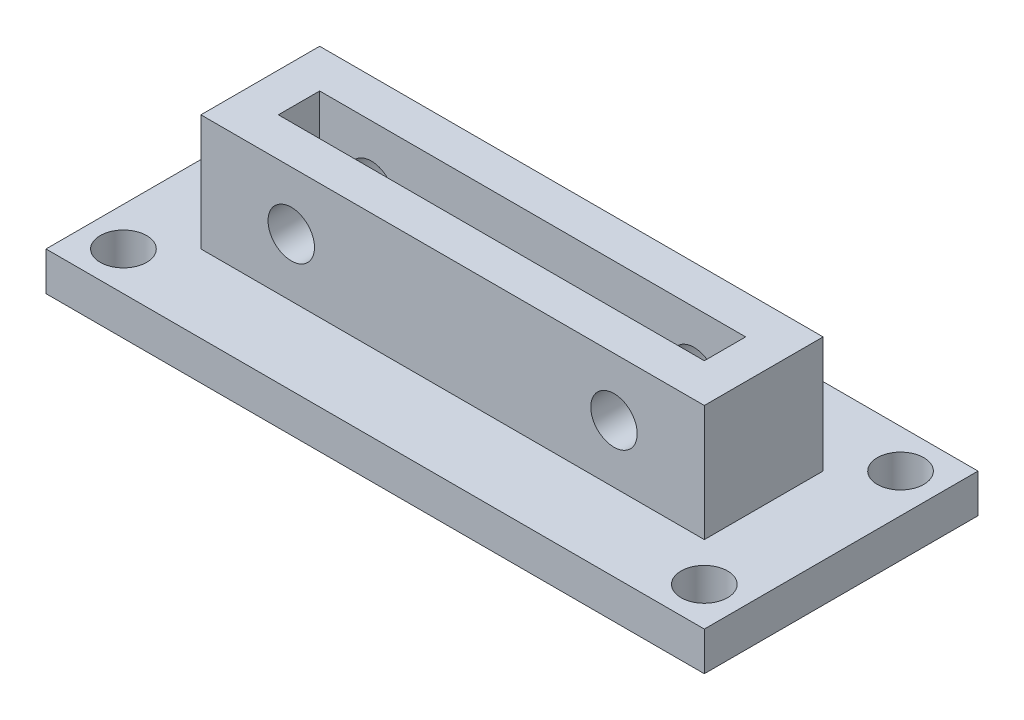
ISO-10303-21;
HEADER;
FILE_DESCRIPTION(('STEP AP214'),'2;1');
FILE_NAME('part.step','',(''),(''),'','','');
FILE_SCHEMA(('AUTOMOTIVE_DESIGN { 1 0 10303 214 1 1 1 1 }'));
ENDSEC;
DATA;
#1=APPLICATION_CONTEXT('core data for automotive mechanical design processes');
#2=APPLICATION_PROTOCOL_DEFINITION('international standard','automotive_design',2000,#1);
#3=PRODUCT_CONTEXT('',#1,'mechanical');
#4=PRODUCT('Part','Part','',(#3));
#5=PRODUCT_RELATED_PRODUCT_CATEGORY('part','',(#4));
#6=PRODUCT_DEFINITION_FORMATION('','',#4);
#7=PRODUCT_DEFINITION_CONTEXT('part definition',#1,'design');
#8=PRODUCT_DEFINITION('design','',#6,#7);
#9=PRODUCT_DEFINITION_SHAPE('','',#8);
#10=(LENGTH_UNIT() NAMED_UNIT(*) SI_UNIT(.MILLI.,.METRE.));
#11=(NAMED_UNIT(*) PLANE_ANGLE_UNIT() SI_UNIT($,.RADIAN.));
#12=(NAMED_UNIT(*) SI_UNIT($,.STERADIAN.) SOLID_ANGLE_UNIT());
#13=UNCERTAINTY_MEASURE_WITH_UNIT(LENGTH_MEASURE(1.E-05),#10,'distance_accuracy_value','');
#14=(GEOMETRIC_REPRESENTATION_CONTEXT(3) GLOBAL_UNCERTAINTY_ASSIGNED_CONTEXT((#13)) GLOBAL_UNIT_ASSIGNED_CONTEXT((#10,
#11,#12)) REPRESENTATION_CONTEXT('',''));
#15=CARTESIAN_POINT('',(0.,0.,0.));
#16=DIRECTION('',(0.,0.,1.));
#17=DIRECTION('',(1.,0.,0.));
#18=AXIS2_PLACEMENT_3D('',#15,#16,#17);
#19=CARTESIAN_POINT('',(0.,3.,0.));
#20=DIRECTION('',(0.,-1.,0.));
#21=DIRECTION('',(0.,0.,-1.));
#22=AXIS2_PLACEMENT_3D('',#19,#20,#21);
#23=PLANE('',#22);
#24=CARTESIAN_POINT('',(3.,3.,-18.2));
#25=DIRECTION('',(0.,1.,0.));
#26=DIRECTION('',(0.,0.,1.));
#27=AXIS2_PLACEMENT_3D('',#24,#25,#26);
#28=CIRCLE('',#27,1.79999999999999);
#29=CARTESIAN_POINT('',(3.,3.,-16.4));
#30=VERTEX_POINT('',#29);
#31=EDGE_CURVE('E246',#30,#30,#28,.T.);
#32=ORIENTED_EDGE('',*,*,#31,.F.);
#33=EDGE_LOOP('',(#32));
#34=FACE_BOUND('',#33,.T.);
#35=CARTESIAN_POINT('',(48.,3.,-18.2));
#36=DIRECTION('',(0.,1.,0.));
#37=DIRECTION('',(0.,0.,1.));
#38=AXIS2_PLACEMENT_3D('',#35,#36,#37);
#39=CIRCLE('',#38,1.79999999999999);
#40=CARTESIAN_POINT('',(48.,3.,-16.4));
#41=VERTEX_POINT('',#40);
#42=EDGE_CURVE('E252',#41,#41,#39,.T.);
#43=ORIENTED_EDGE('',*,*,#42,.F.);
#44=EDGE_LOOP('',(#43));
#45=FACE_BOUND('',#44,.T.);
#46=CARTESIAN_POINT('',(48.,3.,-3.));
#47=DIRECTION('',(0.,1.,0.));
#48=DIRECTION('',(0.,0.,1.));
#49=AXIS2_PLACEMENT_3D('',#46,#47,#48);
#50=CIRCLE('',#49,1.79999999999999);
#51=CARTESIAN_POINT('',(48.,3.,-1.20000000000001));
#52=VERTEX_POINT('',#51);
#53=EDGE_CURVE('E258',#52,#52,#50,.T.);
#54=ORIENTED_EDGE('',*,*,#53,.F.);
#55=EDGE_LOOP('',(#54));
#56=FACE_BOUND('',#55,.T.);
#57=CARTESIAN_POINT('',(3.,3.,-3.));
#58=DIRECTION('',(0.,1.,0.));
#59=DIRECTION('',(0.,0.,1.));
#60=AXIS2_PLACEMENT_3D('',#57,#58,#59);
#61=CIRCLE('',#60,1.79999999999999);
#62=CARTESIAN_POINT('',(3.,3.,-1.20000000000001));
#63=VERTEX_POINT('',#62);
#64=EDGE_CURVE('E264',#63,#63,#61,.T.);
#65=ORIENTED_EDGE('',*,*,#64,.F.);
#66=EDGE_LOOP('',(#65));
#67=FACE_BOUND('',#66,.T.);
#68=DIRECTION('',(0.,0.,1.));
#69=VECTOR('',#68,1.);
#70=CARTESIAN_POINT('',(0.,3.,0.));
#71=LINE('',#70,#69);
#72=CARTESIAN_POINT('',(0.,3.,-21.2));
#73=VERTEX_POINT('',#72);
#74=CARTESIAN_POINT('',(0.,3.,0.));
#75=VERTEX_POINT('',#74);
#76=EDGE_CURVE('E201',#73,#75,#71,.T.);
#77=ORIENTED_EDGE('',*,*,#76,.T.);
#78=DIRECTION('',(1.,0.,0.));
#79=VECTOR('',#78,1.);
#80=CARTESIAN_POINT('',(0.,3.,0.));
#81=LINE('',#80,#79);
#82=CARTESIAN_POINT('',(51.,3.,0.));
#83=VERTEX_POINT('',#82);
#84=EDGE_CURVE('E204',#75,#83,#81,.T.);
#85=ORIENTED_EDGE('',*,*,#84,.T.);
#86=DIRECTION('',(0.,0.,-1.));
#87=VECTOR('',#86,1.);
#88=CARTESIAN_POINT('',(51.,3.,0.));
#89=LINE('',#88,#87);
#90=CARTESIAN_POINT('',(51.,3.,-21.2));
#91=VERTEX_POINT('',#90);
#92=EDGE_CURVE('E207',#83,#91,#89,.T.);
#93=ORIENTED_EDGE('',*,*,#92,.T.);
#94=DIRECTION('',(-1.,0.,0.));
#95=VECTOR('',#94,1.);
#96=CARTESIAN_POINT('',(0.,3.,-21.2));
#97=LINE('',#96,#95);
#98=EDGE_CURVE('E209',#91,#73,#97,.T.);
#99=ORIENTED_EDGE('',*,*,#98,.T.);
#100=EDGE_LOOP('',(#77,#85,#93,#99));
#101=FACE_BOUND('',#100,.T.);
#102=DIRECTION('',(0.,0.,1.));
#103=VECTOR('',#102,1.);
#104=CARTESIAN_POINT('',(6.,3.,-15.2));
#105=LINE('',#104,#103);
#106=CARTESIAN_POINT('',(6.,3.,-15.2));
#107=VERTEX_POINT('',#106);
#108=CARTESIAN_POINT('',(6.,3.,-6.));
#109=VERTEX_POINT('',#108);
#110=EDGE_CURVE('E147',#107,#109,#105,.T.);
#111=ORIENTED_EDGE('',*,*,#110,.F.);
#112=DIRECTION('',(-1.,0.,0.));
#113=VECTOR('',#112,1.);
#114=CARTESIAN_POINT('',(6.,3.,-15.2));
#115=LINE('',#114,#113);
#116=CARTESIAN_POINT('',(45.,3.,-15.2));
#117=VERTEX_POINT('',#116);
#118=EDGE_CURVE('E177',#117,#107,#115,.T.);
#119=ORIENTED_EDGE('',*,*,#118,.F.);
#120=DIRECTION('',(0.,0.,-1.));
#121=VECTOR('',#120,1.);
#122=CARTESIAN_POINT('',(45.,3.,-15.2));
#123=LINE('',#122,#121);
#124=CARTESIAN_POINT('',(45.,3.,-6.));
#125=VERTEX_POINT('',#124);
#126=EDGE_CURVE('E61',#125,#117,#123,.T.);
#127=ORIENTED_EDGE('',*,*,#126,.F.);
#128=DIRECTION('',(1.,0.,0.));
#129=VECTOR('',#128,1.);
#130=CARTESIAN_POINT('',(6.,3.,-6.));
#131=LINE('',#130,#129);
#132=EDGE_CURVE('E56',#109,#125,#131,.T.);
#133=ORIENTED_EDGE('',*,*,#132,.F.);
#134=EDGE_LOOP('',(#111,#119,#127,#133));
#135=FACE_BOUND('',#134,.T.);
#136=ADVANCED_FACE('F39',(#34,#45,#56,#67,#101,#135),#23,.F.);
#137=CARTESIAN_POINT('',(0.,3.,0.));
#138=DIRECTION('',(1.,0.,0.));
#139=DIRECTION('',(0.,0.,-1.));
#140=AXIS2_PLACEMENT_3D('',#137,#138,#139);
#141=PLANE('',#140);
#142=DIRECTION('',(0.,0.,1.));
#143=VECTOR('',#142,1.);
#144=CARTESIAN_POINT('',(0.,0.,0.));
#145=LINE('',#144,#143);
#146=CARTESIAN_POINT('',(0.,0.,-21.2));
#147=VERTEX_POINT('',#146);
#148=CARTESIAN_POINT('',(0.,0.,0.));
#149=VERTEX_POINT('',#148);
#150=EDGE_CURVE('E200',#147,#149,#145,.T.);
#151=ORIENTED_EDGE('',*,*,#150,.T.);
#152=DIRECTION('',(0.,-1.,0.));
#153=VECTOR('',#152,1.);
#154=CARTESIAN_POINT('',(0.,3.,0.));
#155=LINE('',#154,#153);
#156=EDGE_CURVE('E11',#75,#149,#155,.T.);
#157=ORIENTED_EDGE('',*,*,#156,.F.);
#158=ORIENTED_EDGE('',*,*,#76,.F.);
#159=DIRECTION('',(0.,-1.,0.));
#160=VECTOR('',#159,1.);
#161=CARTESIAN_POINT('',(0.,3.,-21.2));
#162=LINE('',#161,#160);
#163=EDGE_CURVE('E211',#73,#147,#162,.T.);
#164=ORIENTED_EDGE('',*,*,#163,.T.);
#165=EDGE_LOOP('',(#151,#157,#158,#164));
#166=FACE_BOUND('',#165,.T.);
#167=ADVANCED_FACE('F41',(#166),#141,.F.);
#168=CARTESIAN_POINT('',(0.,3.,0.));
#169=DIRECTION('',(0.,0.,-1.));
#170=DIRECTION('',(-1.,0.,0.));
#171=AXIS2_PLACEMENT_3D('',#168,#169,#170);
#172=PLANE('',#171);
#173=DIRECTION('',(1.,0.,0.));
#174=VECTOR('',#173,1.);
#175=CARTESIAN_POINT('',(0.,0.,0.));
#176=LINE('',#175,#174);
#177=CARTESIAN_POINT('',(51.,0.,0.));
#178=VERTEX_POINT('',#177);
#179=EDGE_CURVE('E214',#149,#178,#176,.T.);
#180=ORIENTED_EDGE('',*,*,#179,.T.);
#181=DIRECTION('',(0.,-1.,0.));
#182=VECTOR('',#181,1.);
#183=CARTESIAN_POINT('',(51.,3.,0.));
#184=LINE('',#183,#182);
#185=EDGE_CURVE('E48',#83,#178,#184,.T.);
#186=ORIENTED_EDGE('',*,*,#185,.F.);
#187=ORIENTED_EDGE('',*,*,#84,.F.);
#188=ORIENTED_EDGE('',*,*,#156,.T.);
#189=EDGE_LOOP('',(#180,#186,#187,#188));
#190=FACE_BOUND('',#189,.T.);
#191=ADVANCED_FACE('F329',(#190),#172,.F.);
#192=CARTESIAN_POINT('',(51.,3.,0.));
#193=DIRECTION('',(-1.,0.,0.));
#194=DIRECTION('',(0.,0.,1.));
#195=AXIS2_PLACEMENT_3D('',#192,#193,#194);
#196=PLANE('',#195);
#197=DIRECTION('',(0.,0.,-1.));
#198=VECTOR('',#197,1.);
#199=CARTESIAN_POINT('',(51.,0.,0.));
#200=LINE('',#199,#198);
#201=CARTESIAN_POINT('',(51.,0.,-21.2));
#202=VERTEX_POINT('',#201);
#203=EDGE_CURVE('E216',#178,#202,#200,.T.);
#204=ORIENTED_EDGE('',*,*,#203,.T.);
#205=DIRECTION('',(0.,-1.,0.));
#206=VECTOR('',#205,1.);
#207=CARTESIAN_POINT('',(51.,3.,-21.2));
#208=LINE('',#207,#206);
#209=EDGE_CURVE('E221',#91,#202,#208,.T.);
#210=ORIENTED_EDGE('',*,*,#209,.F.);
#211=ORIENTED_EDGE('',*,*,#92,.F.);
#212=ORIENTED_EDGE('',*,*,#185,.T.);
#213=EDGE_LOOP('',(#204,#210,#211,#212));
#214=FACE_BOUND('',#213,.T.);
#215=ADVANCED_FACE('F326',(#214),#196,.F.);
#216=CARTESIAN_POINT('',(0.,3.,-21.2));
#217=DIRECTION('',(0.,0.,1.));
#218=DIRECTION('',(1.,0.,0.));
#219=AXIS2_PLACEMENT_3D('',#216,#217,#218);
#220=PLANE('',#219);
#221=DIRECTION('',(-1.,0.,0.));
#222=VECTOR('',#221,1.);
#223=CARTESIAN_POINT('',(0.,0.,-21.2));
#224=LINE('',#223,#222);
#225=EDGE_CURVE('E205',#202,#147,#224,.T.);
#226=ORIENTED_EDGE('',*,*,#225,.T.);
#227=ORIENTED_EDGE('',*,*,#163,.F.);
#228=ORIENTED_EDGE('',*,*,#98,.F.);
#229=ORIENTED_EDGE('',*,*,#209,.T.);
#230=EDGE_LOOP('',(#226,#227,#228,#229));
#231=FACE_BOUND('',#230,.T.);
#232=ADVANCED_FACE('F322',(#231),#220,.F.);
#233=CARTESIAN_POINT('',(0.,0.,0.));
#234=DIRECTION('',(0.,-1.,0.));
#235=DIRECTION('',(0.,0.,-1.));
#236=AXIS2_PLACEMENT_3D('',#233,#234,#235);
#237=PLANE('',#236);
#238=CARTESIAN_POINT('',(3.,0.,-18.2));
#239=DIRECTION('',(0.,1.,0.));
#240=DIRECTION('',(0.,0.,1.));
#241=AXIS2_PLACEMENT_3D('',#238,#239,#240);
#242=CIRCLE('',#241,1.8);
#243=CARTESIAN_POINT('',(3.,0.,-16.4));
#244=VERTEX_POINT('',#243);
#245=EDGE_CURVE('E249',#244,#244,#242,.T.);
#246=ORIENTED_EDGE('',*,*,#245,.T.);
#247=EDGE_LOOP('',(#246));
#248=FACE_BOUND('',#247,.T.);
#249=CARTESIAN_POINT('',(48.,0.,-18.2));
#250=DIRECTION('',(0.,1.,0.));
#251=DIRECTION('',(0.,0.,1.));
#252=AXIS2_PLACEMENT_3D('',#249,#250,#251);
#253=CIRCLE('',#252,1.8);
#254=CARTESIAN_POINT('',(48.,0.,-16.4));
#255=VERTEX_POINT('',#254);
#256=EDGE_CURVE('E255',#255,#255,#253,.T.);
#257=ORIENTED_EDGE('',*,*,#256,.T.);
#258=EDGE_LOOP('',(#257));
#259=FACE_BOUND('',#258,.T.);
#260=CARTESIAN_POINT('',(48.,0.,-3.));
#261=DIRECTION('',(0.,1.,0.));
#262=DIRECTION('',(0.,0.,1.));
#263=AXIS2_PLACEMENT_3D('',#260,#261,#262);
#264=CIRCLE('',#263,1.8);
#265=CARTESIAN_POINT('',(48.,0.,-1.19999999999999));
#266=VERTEX_POINT('',#265);
#267=EDGE_CURVE('E261',#266,#266,#264,.T.);
#268=ORIENTED_EDGE('',*,*,#267,.T.);
#269=EDGE_LOOP('',(#268));
#270=FACE_BOUND('',#269,.T.);
#271=CARTESIAN_POINT('',(3.,0.,-3.));
#272=DIRECTION('',(0.,1.,0.));
#273=DIRECTION('',(0.,0.,1.));
#274=AXIS2_PLACEMENT_3D('',#271,#272,#273);
#275=CIRCLE('',#274,1.8);
#276=CARTESIAN_POINT('',(3.,0.,-1.2));
#277=VERTEX_POINT('',#276);
#278=EDGE_CURVE('E162',#277,#277,#275,.T.);
#279=ORIENTED_EDGE('',*,*,#278,.T.);
#280=EDGE_LOOP('',(#279));
#281=FACE_BOUND('',#280,.T.);
#282=ORIENTED_EDGE('',*,*,#150,.F.);
#283=ORIENTED_EDGE('',*,*,#225,.F.);
#284=ORIENTED_EDGE('',*,*,#203,.F.);
#285=ORIENTED_EDGE('',*,*,#179,.F.);
#286=EDGE_LOOP('',(#282,#283,#284,#285));
#287=FACE_BOUND('',#286,.T.);
#288=ADVANCED_FACE('F269',(#248,#259,#270,#281,#287),#237,.T.);
#289=CARTESIAN_POINT('',(0.,12.,0.));
#290=DIRECTION('',(0.,1.,0.));
#291=DIRECTION('',(0.,0.,1.));
#292=AXIS2_PLACEMENT_3D('',#289,#290,#291);
#293=PLANE('',#292);
#294=DIRECTION('',(0.,0.,1.));
#295=VECTOR('',#294,1.);
#296=CARTESIAN_POINT('',(6.,12.,-15.2));
#297=LINE('',#296,#295);
#298=CARTESIAN_POINT('',(6.,12.,-15.2));
#299=VERTEX_POINT('',#298);
#300=CARTESIAN_POINT('',(6.,12.,-6.));
#301=VERTEX_POINT('',#300);
#302=EDGE_CURVE('E173',#299,#301,#297,.T.);
#303=ORIENTED_EDGE('',*,*,#302,.T.);
#304=DIRECTION('',(1.,0.,0.));
#305=VECTOR('',#304,1.);
#306=CARTESIAN_POINT('',(6.,12.,-6.));
#307=LINE('',#306,#305);
#308=CARTESIAN_POINT('',(45.,12.,-6.));
#309=VERTEX_POINT('',#308);
#310=EDGE_CURVE('E176',#301,#309,#307,.T.);
#311=ORIENTED_EDGE('',*,*,#310,.T.);
#312=DIRECTION('',(0.,0.,-1.));
#313=VECTOR('',#312,1.);
#314=CARTESIAN_POINT('',(45.,12.,-15.2));
#315=LINE('',#314,#313);
#316=CARTESIAN_POINT('',(45.,12.,-15.2));
#317=VERTEX_POINT('',#316);
#318=EDGE_CURVE('E179',#309,#317,#315,.T.);
#319=ORIENTED_EDGE('',*,*,#318,.T.);
#320=DIRECTION('',(-1.,0.,0.));
#321=VECTOR('',#320,1.);
#322=CARTESIAN_POINT('',(6.,12.,-15.2));
#323=LINE('',#322,#321);
#324=EDGE_CURVE('E181',#317,#299,#323,.T.);
#325=ORIENTED_EDGE('',*,*,#324,.T.);
#326=EDGE_LOOP('',(#303,#311,#319,#325));
#327=FACE_BOUND('',#326,.T.);
#328=DIRECTION('',(1.,0.,0.));
#329=VECTOR('',#328,1.);
#330=CARTESIAN_POINT('',(9.,12.,-9.));
#331=LINE('',#330,#329);
#332=CARTESIAN_POINT('',(9.,12.,-9.));
#333=VERTEX_POINT('',#332);
#334=CARTESIAN_POINT('',(42.,12.,-9.));
#335=VERTEX_POINT('',#334);
#336=EDGE_CURVE('E139',#333,#335,#331,.T.);
#337=ORIENTED_EDGE('',*,*,#336,.F.);
#338=DIRECTION('',(0.,0.,1.));
#339=VECTOR('',#338,1.);
#340=CARTESIAN_POINT('',(9.,12.,-12.2));
#341=LINE('',#340,#339);
#342=CARTESIAN_POINT('',(9.,12.,-12.2));
#343=VERTEX_POINT('',#342);
#344=EDGE_CURVE('E129',#343,#333,#341,.T.);
#345=ORIENTED_EDGE('',*,*,#344,.F.);
#346=DIRECTION('',(-1.,0.,0.));
#347=VECTOR('',#346,1.);
#348=CARTESIAN_POINT('',(9.,12.,-12.2));
#349=LINE('',#348,#347);
#350=CARTESIAN_POINT('',(42.,12.,-12.2));
#351=VERTEX_POINT('',#350);
#352=EDGE_CURVE('E155',#351,#343,#349,.T.);
#353=ORIENTED_EDGE('',*,*,#352,.F.);
#354=DIRECTION('',(0.,0.,-1.));
#355=VECTOR('',#354,1.);
#356=CARTESIAN_POINT('',(42.,12.,-12.2));
#357=LINE('',#356,#355);
#358=EDGE_CURVE('E153',#335,#351,#357,.T.);
#359=ORIENTED_EDGE('',*,*,#358,.F.);
#360=EDGE_LOOP('',(#337,#345,#353,#359));
#361=FACE_BOUND('',#360,.T.);
#362=ADVANCED_FACE('F151',(#327,#361),#293,.T.);
#363=CARTESIAN_POINT('',(6.,12.,-15.2));
#364=DIRECTION('',(1.,0.,0.));
#365=DIRECTION('',(0.,0.,-1.));
#366=AXIS2_PLACEMENT_3D('',#363,#364,#365);
#367=PLANE('',#366);
#368=ORIENTED_EDGE('',*,*,#110,.T.);
#369=DIRECTION('',(0.,-1.,0.));
#370=VECTOR('',#369,1.);
#371=CARTESIAN_POINT('',(6.,12.,-6.));
#372=LINE('',#371,#370);
#373=EDGE_CURVE('E198',#301,#109,#372,.T.);
#374=ORIENTED_EDGE('',*,*,#373,.F.);
#375=ORIENTED_EDGE('',*,*,#302,.F.);
#376=DIRECTION('',(0.,-1.,0.));
#377=VECTOR('',#376,1.);
#378=CARTESIAN_POINT('',(6.,12.,-15.2));
#379=LINE('',#378,#377);
#380=EDGE_CURVE('E183',#299,#107,#379,.T.);
#381=ORIENTED_EDGE('',*,*,#380,.T.);
#382=EDGE_LOOP('',(#368,#374,#375,#381));
#383=FACE_BOUND('',#382,.T.);
#384=ADVANCED_FACE('F294',(#383),#367,.F.);
#385=CARTESIAN_POINT('',(6.,12.,-6.));
#386=DIRECTION('',(0.,0.,-1.));
#387=DIRECTION('',(-1.,0.,0.));
#388=AXIS2_PLACEMENT_3D('',#385,#386,#387);
#389=PLANE('',#388);
#390=CARTESIAN_POINT('',(13.,7.5,-6.));
#391=DIRECTION('',(0.,0.,1.));
#392=DIRECTION('',(1.,0.,0.));
#393=AXIS2_PLACEMENT_3D('',#390,#391,#392);
#394=CIRCLE('',#393,1.79999999999999);
#395=CARTESIAN_POINT('',(14.8,7.5,-6.));
#396=VERTEX_POINT('',#395);
#397=EDGE_CURVE('E483',#396,#396,#394,.T.);
#398=ORIENTED_EDGE('',*,*,#397,.F.);
#399=EDGE_LOOP('',(#398));
#400=FACE_BOUND('',#399,.T.);
#401=CARTESIAN_POINT('',(38.,7.5,-6.));
#402=DIRECTION('',(0.,0.,1.));
#403=DIRECTION('',(1.,0.,0.));
#404=AXIS2_PLACEMENT_3D('',#401,#402,#403);
#405=CIRCLE('',#404,1.79999999999999);
#406=CARTESIAN_POINT('',(39.8,7.5,-6.));
#407=VERTEX_POINT('',#406);
#408=EDGE_CURVE('E228',#407,#407,#405,.T.);
#409=ORIENTED_EDGE('',*,*,#408,.F.);
#410=EDGE_LOOP('',(#409));
#411=FACE_BOUND('',#410,.T.);
#412=ORIENTED_EDGE('',*,*,#132,.T.);
#413=DIRECTION('',(0.,-1.,0.));
#414=VECTOR('',#413,1.);
#415=CARTESIAN_POINT('',(45.,12.,-6.));
#416=LINE('',#415,#414);
#417=EDGE_CURVE('E195',#309,#125,#416,.T.);
#418=ORIENTED_EDGE('',*,*,#417,.F.);
#419=ORIENTED_EDGE('',*,*,#310,.F.);
#420=ORIENTED_EDGE('',*,*,#373,.T.);
#421=EDGE_LOOP('',(#412,#418,#419,#420));
#422=FACE_BOUND('',#421,.T.);
#423=ADVANCED_FACE('F301',(#400,#411,#422),#389,.F.);
#424=CARTESIAN_POINT('',(45.,12.,-15.2));
#425=DIRECTION('',(-1.,0.,0.));
#426=DIRECTION('',(0.,0.,1.));
#427=AXIS2_PLACEMENT_3D('',#424,#425,#426);
#428=PLANE('',#427);
#429=ORIENTED_EDGE('',*,*,#126,.T.);
#430=DIRECTION('',(0.,-1.,0.));
#431=VECTOR('',#430,1.);
#432=CARTESIAN_POINT('',(45.,12.,-15.2));
#433=LINE('',#432,#431);
#434=EDGE_CURVE('E192',#317,#117,#433,.T.);
#435=ORIENTED_EDGE('',*,*,#434,.F.);
#436=ORIENTED_EDGE('',*,*,#318,.F.);
#437=ORIENTED_EDGE('',*,*,#417,.T.);
#438=EDGE_LOOP('',(#429,#435,#436,#437));
#439=FACE_BOUND('',#438,.T.);
#440=ADVANCED_FACE('F299',(#439),#428,.F.);
#441=CARTESIAN_POINT('',(6.,12.,-15.2));
#442=DIRECTION('',(0.,0.,1.));
#443=DIRECTION('',(1.,0.,0.));
#444=AXIS2_PLACEMENT_3D('',#441,#442,#443);
#445=PLANE('',#444);
#446=CARTESIAN_POINT('',(13.,7.5,-15.2));
#447=DIRECTION('',(0.,0.,1.));
#448=DIRECTION('',(1.,0.,0.));
#449=AXIS2_PLACEMENT_3D('',#446,#447,#448);
#450=CIRCLE('',#449,1.79999999999999);
#451=CARTESIAN_POINT('',(14.8,7.5,-15.2));
#452=VERTEX_POINT('',#451);
#453=EDGE_CURVE('E235',#452,#452,#450,.T.);
#454=ORIENTED_EDGE('',*,*,#453,.T.);
#455=EDGE_LOOP('',(#454));
#456=FACE_BOUND('',#455,.T.);
#457=CARTESIAN_POINT('',(38.,7.5,-15.2));
#458=DIRECTION('',(0.,0.,1.));
#459=DIRECTION('',(1.,0.,0.));
#460=AXIS2_PLACEMENT_3D('',#457,#458,#459);
#461=CIRCLE('',#460,1.79999999999999);
#462=CARTESIAN_POINT('',(39.8,7.5,-15.2));
#463=VERTEX_POINT('',#462);
#464=EDGE_CURVE('E232',#463,#463,#461,.T.);
#465=ORIENTED_EDGE('',*,*,#464,.T.);
#466=EDGE_LOOP('',(#465));
#467=FACE_BOUND('',#466,.T.);
#468=ORIENTED_EDGE('',*,*,#118,.T.);
#469=ORIENTED_EDGE('',*,*,#380,.F.);
#470=ORIENTED_EDGE('',*,*,#324,.F.);
#471=ORIENTED_EDGE('',*,*,#434,.T.);
#472=EDGE_LOOP('',(#468,#469,#470,#471));
#473=FACE_BOUND('',#472,.T.);
#474=ADVANCED_FACE('F290',(#456,#467,#473),#445,.F.);
#475=CARTESIAN_POINT('',(9.,12.,-12.2));
#476=DIRECTION('',(1.,0.,0.));
#477=DIRECTION('',(0.,0.,-1.));
#478=AXIS2_PLACEMENT_3D('',#475,#476,#477);
#479=PLANE('',#478);
#480=DIRECTION('',(0.,0.,1.));
#481=VECTOR('',#480,1.);
#482=CARTESIAN_POINT('',(9.,3.,-12.2));
#483=LINE('',#482,#481);
#484=CARTESIAN_POINT('',(9.,3.,-12.2));
#485=VERTEX_POINT('',#484);
#486=CARTESIAN_POINT('',(9.,3.,-9.));
#487=VERTEX_POINT('',#486);
#488=EDGE_CURVE('E160',#485,#487,#483,.T.);
#489=ORIENTED_EDGE('',*,*,#488,.F.);
#490=DIRECTION('',(0.,-1.,0.));
#491=VECTOR('',#490,1.);
#492=CARTESIAN_POINT('',(9.,12.,-12.2));
#493=LINE('',#492,#491);
#494=EDGE_CURVE('E135',#343,#485,#493,.T.);
#495=ORIENTED_EDGE('',*,*,#494,.F.);
#496=ORIENTED_EDGE('',*,*,#344,.T.);
#497=DIRECTION('',(0.,-1.,0.));
#498=VECTOR('',#497,1.);
#499=CARTESIAN_POINT('',(9.,12.,-9.));
#500=LINE('',#499,#498);
#501=EDGE_CURVE('E133',#333,#487,#500,.T.);
#502=ORIENTED_EDGE('',*,*,#501,.T.);
#503=EDGE_LOOP('',(#489,#495,#496,#502));
#504=FACE_BOUND('',#503,.T.);
#505=ADVANCED_FACE('F132',(#504),#479,.T.);
#506=CARTESIAN_POINT('',(9.,12.,-9.));
#507=DIRECTION('',(0.,0.,-1.));
#508=DIRECTION('',(-1.,0.,0.));
#509=AXIS2_PLACEMENT_3D('',#506,#507,#508);
#510=PLANE('',#509);
#511=CARTESIAN_POINT('',(13.,7.5,-9.));
#512=DIRECTION('',(0.,0.,-1.));
#513=DIRECTION('',(-1.,0.,0.));
#514=AXIS2_PLACEMENT_3D('',#511,#512,#513);
#515=CIRCLE('',#514,1.79999999999999);
#516=CARTESIAN_POINT('',(11.2,7.5,-9.));
#517=VERTEX_POINT('',#516);
#518=EDGE_CURVE('E43',#517,#517,#515,.T.);
#519=ORIENTED_EDGE('',*,*,#518,.F.);
#520=EDGE_LOOP('',(#519));
#521=FACE_BOUND('',#520,.T.);
#522=CARTESIAN_POINT('',(38.,7.5,-9.));
#523=DIRECTION('',(0.,0.,-1.));
#524=DIRECTION('',(-1.,0.,0.));
#525=AXIS2_PLACEMENT_3D('',#522,#523,#524);
#526=CIRCLE('',#525,1.79999999999999);
#527=CARTESIAN_POINT('',(36.2,7.5,-9.));
#528=VERTEX_POINT('',#527);
#529=EDGE_CURVE('E225',#528,#528,#526,.T.);
#530=ORIENTED_EDGE('',*,*,#529,.F.);
#531=EDGE_LOOP('',(#530));
#532=FACE_BOUND('',#531,.T.);
#533=DIRECTION('',(1.,0.,0.));
#534=VECTOR('',#533,1.);
#535=CARTESIAN_POINT('',(9.,3.,-9.));
#536=LINE('',#535,#534);
#537=CARTESIAN_POINT('',(42.,3.,-9.));
#538=VERTEX_POINT('',#537);
#539=EDGE_CURVE('E146',#487,#538,#536,.T.);
#540=ORIENTED_EDGE('',*,*,#539,.F.);
#541=ORIENTED_EDGE('',*,*,#501,.F.);
#542=ORIENTED_EDGE('',*,*,#336,.T.);
#543=DIRECTION('',(0.,-1.,0.));
#544=VECTOR('',#543,1.);
#545=CARTESIAN_POINT('',(42.,12.,-9.));
#546=LINE('',#545,#544);
#547=EDGE_CURVE('E148',#335,#538,#546,.T.);
#548=ORIENTED_EDGE('',*,*,#547,.T.);
#549=EDGE_LOOP('',(#540,#541,#542,#548));
#550=FACE_BOUND('',#549,.T.);
#551=ADVANCED_FACE('F143',(#521,#532,#550),#510,.T.);
#552=CARTESIAN_POINT('',(42.,12.,-12.2));
#553=DIRECTION('',(-1.,0.,0.));
#554=DIRECTION('',(0.,0.,1.));
#555=AXIS2_PLACEMENT_3D('',#552,#553,#554);
#556=PLANE('',#555);
#557=DIRECTION('',(0.,0.,-1.));
#558=VECTOR('',#557,1.);
#559=CARTESIAN_POINT('',(42.,3.,-12.2));
#560=LINE('',#559,#558);
#561=CARTESIAN_POINT('',(42.,3.,-12.2));
#562=VERTEX_POINT('',#561);
#563=EDGE_CURVE('E164',#538,#562,#560,.T.);
#564=ORIENTED_EDGE('',*,*,#563,.F.);
#565=ORIENTED_EDGE('',*,*,#547,.F.);
#566=ORIENTED_EDGE('',*,*,#358,.T.);
#567=DIRECTION('',(0.,-1.,0.));
#568=VECTOR('',#567,1.);
#569=CARTESIAN_POINT('',(42.,12.,-12.2));
#570=LINE('',#569,#568);
#571=EDGE_CURVE('E170',#351,#562,#570,.T.);
#572=ORIENTED_EDGE('',*,*,#571,.T.);
#573=EDGE_LOOP('',(#564,#565,#566,#572));
#574=FACE_BOUND('',#573,.T.);
#575=ADVANCED_FACE('F404',(#574),#556,.T.);
#576=CARTESIAN_POINT('',(9.,12.,-12.2));
#577=DIRECTION('',(0.,0.,1.));
#578=DIRECTION('',(1.,0.,0.));
#579=AXIS2_PLACEMENT_3D('',#576,#577,#578);
#580=PLANE('',#579);
#581=CARTESIAN_POINT('',(13.,7.5,-12.2));
#582=DIRECTION('',(0.,0.,1.));
#583=DIRECTION('',(1.,0.,0.));
#584=AXIS2_PLACEMENT_3D('',#581,#582,#583);
#585=CIRCLE('',#584,1.79999999999999);
#586=CARTESIAN_POINT('',(14.8,7.5,-12.2));
#587=VERTEX_POINT('',#586);
#588=EDGE_CURVE('E240',#587,#587,#585,.T.);
#589=ORIENTED_EDGE('',*,*,#588,.F.);
#590=EDGE_LOOP('',(#589));
#591=FACE_BOUND('',#590,.T.);
#592=CARTESIAN_POINT('',(38.,7.5,-12.2));
#593=DIRECTION('',(0.,0.,1.));
#594=DIRECTION('',(1.,0.,0.));
#595=AXIS2_PLACEMENT_3D('',#592,#593,#594);
#596=CIRCLE('',#595,1.79999999999999);
#597=CARTESIAN_POINT('',(39.8,7.5,-12.2));
#598=VERTEX_POINT('',#597);
#599=EDGE_CURVE('E227',#598,#598,#596,.T.);
#600=ORIENTED_EDGE('',*,*,#599,.F.);
#601=EDGE_LOOP('',(#600));
#602=FACE_BOUND('',#601,.T.);
#603=DIRECTION('',(-1.,0.,0.));
#604=VECTOR('',#603,1.);
#605=CARTESIAN_POINT('',(9.,3.,-12.2));
#606=LINE('',#605,#604);
#607=EDGE_CURVE('E140',#562,#485,#606,.T.);
#608=ORIENTED_EDGE('',*,*,#607,.F.);
#609=ORIENTED_EDGE('',*,*,#571,.F.);
#610=ORIENTED_EDGE('',*,*,#352,.T.);
#611=ORIENTED_EDGE('',*,*,#494,.T.);
#612=EDGE_LOOP('',(#608,#609,#610,#611));
#613=FACE_BOUND('',#612,.T.);
#614=ADVANCED_FACE('F318',(#591,#602,#613),#580,.T.);
#615=ORIENTED_EDGE('',*,*,#607,.T.);
#616=ORIENTED_EDGE('',*,*,#488,.T.);
#617=ORIENTED_EDGE('',*,*,#539,.T.);
#618=ORIENTED_EDGE('',*,*,#563,.T.);
#619=EDGE_LOOP('',(#615,#616,#617,#618));
#620=FACE_BOUND('',#619,.T.);
#621=ADVANCED_FACE('F276',(#620),#23,.F.);
#622=CARTESIAN_POINT('',(3.,3.,-3.));
#623=DIRECTION('',(0.,1.,0.));
#624=DIRECTION('',(0.,0.,1.));
#625=AXIS2_PLACEMENT_3D('',#622,#623,#624);
#626=CYLINDRICAL_SURFACE('',#625,1.79999999999999);
#627=ORIENTED_EDGE('',*,*,#278,.F.);
#628=EDGE_LOOP('',(#627));
#629=FACE_BOUND('',#628,.T.);
#630=ORIENTED_EDGE('',*,*,#64,.T.);
#631=EDGE_LOOP('',(#630));
#632=FACE_BOUND('',#631,.T.);
#633=ADVANCED_FACE('F272',(#629,#632),#626,.F.);
#634=CARTESIAN_POINT('',(48.,3.,-3.));
#635=DIRECTION('',(0.,1.,0.));
#636=DIRECTION('',(0.,0.,1.));
#637=AXIS2_PLACEMENT_3D('',#634,#635,#636);
#638=CYLINDRICAL_SURFACE('',#637,1.8);
#639=ORIENTED_EDGE('',*,*,#267,.F.);
#640=EDGE_LOOP('',(#639));
#641=FACE_BOUND('',#640,.T.);
#642=ORIENTED_EDGE('',*,*,#53,.T.);
#643=EDGE_LOOP('',(#642));
#644=FACE_BOUND('',#643,.T.);
#645=ADVANCED_FACE('F275',(#641,#644),#638,.F.);
#646=CARTESIAN_POINT('',(48.,3.,-18.2));
#647=DIRECTION('',(0.,1.,0.));
#648=DIRECTION('',(0.,0.,1.));
#649=AXIS2_PLACEMENT_3D('',#646,#647,#648);
#650=CYLINDRICAL_SURFACE('',#649,1.8);
#651=ORIENTED_EDGE('',*,*,#256,.F.);
#652=EDGE_LOOP('',(#651));
#653=FACE_BOUND('',#652,.T.);
#654=ORIENTED_EDGE('',*,*,#42,.T.);
#655=EDGE_LOOP('',(#654));
#656=FACE_BOUND('',#655,.T.);
#657=ADVANCED_FACE('F430',(#653,#656),#650,.F.);
#658=CARTESIAN_POINT('',(3.,3.,-18.2));
#659=DIRECTION('',(0.,1.,0.));
#660=DIRECTION('',(0.,0.,1.));
#661=AXIS2_PLACEMENT_3D('',#658,#659,#660);
#662=CYLINDRICAL_SURFACE('',#661,1.79999999999999);
#663=ORIENTED_EDGE('',*,*,#245,.F.);
#664=EDGE_LOOP('',(#663));
#665=FACE_BOUND('',#664,.T.);
#666=ORIENTED_EDGE('',*,*,#31,.T.);
#667=EDGE_LOOP('',(#666));
#668=FACE_BOUND('',#667,.T.);
#669=ADVANCED_FACE('F438',(#665,#668),#662,.F.);
#670=CARTESIAN_POINT('',(38.,7.5,-6.));
#671=DIRECTION('',(0.,0.,1.));
#672=DIRECTION('',(1.,0.,0.));
#673=AXIS2_PLACEMENT_3D('',#670,#671,#672);
#674=CYLINDRICAL_SURFACE('',#673,1.79999999999999);
#675=ORIENTED_EDGE('',*,*,#529,.T.);
#676=EDGE_LOOP('',(#675));
#677=FACE_BOUND('',#676,.T.);
#678=ORIENTED_EDGE('',*,*,#408,.T.);
#679=EDGE_LOOP('',(#678));
#680=FACE_BOUND('',#679,.T.);
#681=ADVANCED_FACE('F445',(#677,#680),#674,.F.);
#682=ORIENTED_EDGE('',*,*,#599,.T.);
#683=EDGE_LOOP('',(#682));
#684=FACE_BOUND('',#683,.T.);
#685=ORIENTED_EDGE('',*,*,#464,.F.);
#686=EDGE_LOOP('',(#685));
#687=FACE_BOUND('',#686,.T.);
#688=ADVANCED_FACE('F452',(#684,#687),#674,.F.);
#689=CARTESIAN_POINT('',(13.,7.5,-6.));
#690=DIRECTION('',(0.,0.,1.));
#691=DIRECTION('',(1.,0.,0.));
#692=AXIS2_PLACEMENT_3D('',#689,#690,#691);
#693=CYLINDRICAL_SURFACE('',#692,1.79999999999999);
#694=ORIENTED_EDGE('',*,*,#518,.T.);
#695=EDGE_LOOP('',(#694));
#696=FACE_BOUND('',#695,.T.);
#697=ORIENTED_EDGE('',*,*,#397,.T.);
#698=EDGE_LOOP('',(#697));
#699=FACE_BOUND('',#698,.T.);
#700=ADVANCED_FACE('F459',(#696,#699),#693,.F.);
#701=ORIENTED_EDGE('',*,*,#588,.T.);
#702=EDGE_LOOP('',(#701));
#703=FACE_BOUND('',#702,.T.);
#704=ORIENTED_EDGE('',*,*,#453,.F.);
#705=EDGE_LOOP('',(#704));
#706=FACE_BOUND('',#705,.T.);
#707=ADVANCED_FACE('F466',(#703,#706),#693,.F.);
#708=CLOSED_SHELL('',(#136,#167,#191,#215,#232,#288,#362,#384,#423,#440,#474,#505,#551,#575,
#614,#621,#633,#645,#657,#669,#681,#688,#700,#707));
#709=MANIFOLD_SOLID_BREP('B2',#708);
#710=ADVANCED_BREP_SHAPE_REPRESENTATION('',(#18,#709),#14);
#711=SHAPE_DEFINITION_REPRESENTATION(#9,#710);
ENDSEC;
END-ISO-10303-21;
